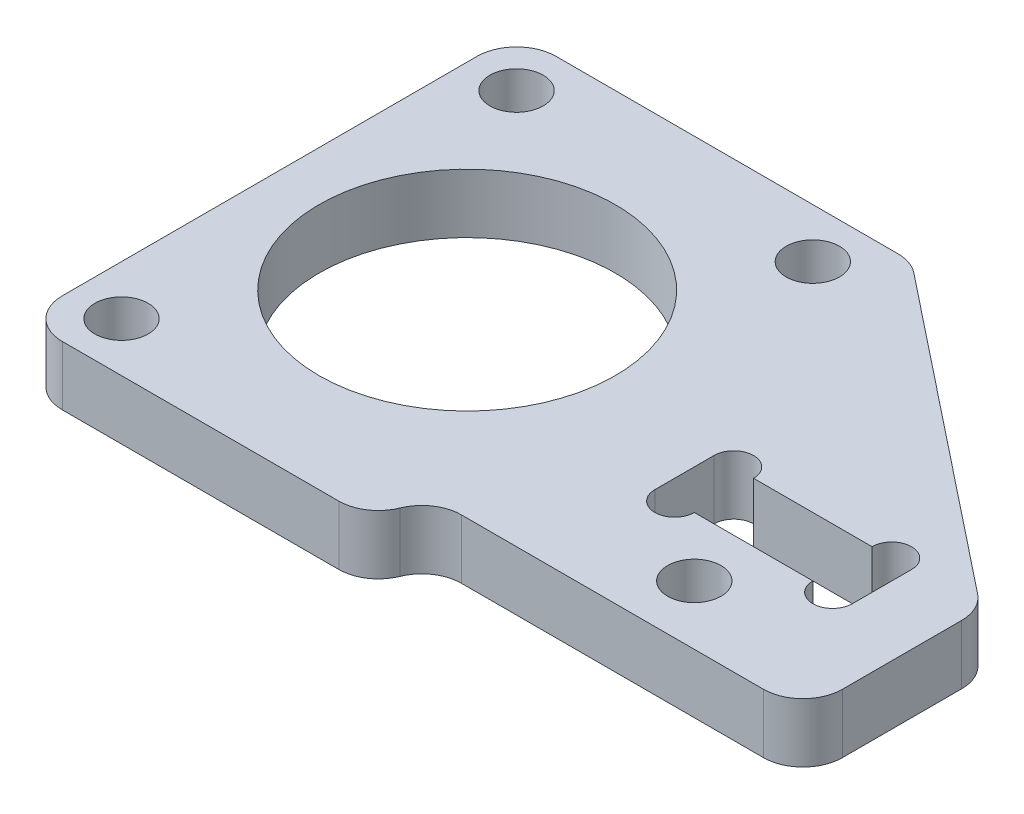
ISO-10303-21;
HEADER;
FILE_DESCRIPTION(('STEP AP214'),'2;1');
FILE_NAME('part.step','',(''),(''),'','','');
FILE_SCHEMA(('AUTOMOTIVE_DESIGN { 1 0 10303 214 1 1 1 1 }'));
ENDSEC;
DATA;
#1=APPLICATION_CONTEXT('core data for automotive mechanical design processes');
#2=APPLICATION_PROTOCOL_DEFINITION('international standard','automotive_design',2000,#1);
#3=PRODUCT_CONTEXT('',#1,'mechanical');
#4=PRODUCT('Part','Part','',(#3));
#5=PRODUCT_RELATED_PRODUCT_CATEGORY('part','',(#4));
#6=PRODUCT_DEFINITION_FORMATION('','',#4);
#7=PRODUCT_DEFINITION_CONTEXT('part definition',#1,'design');
#8=PRODUCT_DEFINITION('design','',#6,#7);
#9=PRODUCT_DEFINITION_SHAPE('','',#8);
#10=(LENGTH_UNIT() NAMED_UNIT(*) SI_UNIT(.MILLI.,.METRE.));
#11=(NAMED_UNIT(*) PLANE_ANGLE_UNIT() SI_UNIT($,.RADIAN.));
#12=(NAMED_UNIT(*) SI_UNIT($,.STERADIAN.) SOLID_ANGLE_UNIT());
#13=UNCERTAINTY_MEASURE_WITH_UNIT(LENGTH_MEASURE(1.E-05),#10,'distance_accuracy_value','');
#14=(GEOMETRIC_REPRESENTATION_CONTEXT(3) GLOBAL_UNCERTAINTY_ASSIGNED_CONTEXT((#13)) GLOBAL_UNIT_ASSIGNED_CONTEXT((#10,
#11,#12)) REPRESENTATION_CONTEXT('',''));
#15=CARTESIAN_POINT('',(0.,0.,0.));
#16=DIRECTION('',(0.,0.,1.));
#17=DIRECTION('',(1.,0.,0.));
#18=AXIS2_PLACEMENT_3D('',#15,#16,#17);
#19=CARTESIAN_POINT('',(10.,3.,4.));
#20=DIRECTION('',(0.,0.,1.));
#21=DIRECTION('',(1.,0.,0.));
#22=AXIS2_PLACEMENT_3D('',#19,#20,#21);
#23=PLANE('',#22);
#24=DIRECTION('',(-1.,0.,0.));
#25=VECTOR('',#24,1.);
#26=CARTESIAN_POINT('',(10.,3.,4.));
#27=LINE('',#26,#25);
#28=CARTESIAN_POINT('',(21.5,3.,4.));
#29=VERTEX_POINT('',#28);
#30=CARTESIAN_POINT('',(15.5,3.,4.));
#31=VERTEX_POINT('',#30);
#32=EDGE_CURVE('E276',#29,#31,#27,.T.);
#33=ORIENTED_EDGE('',*,*,#32,.F.);
#34=DIRECTION('',(0.,1.,0.));
#35=VECTOR('',#34,1.);
#36=CARTESIAN_POINT('',(21.5,0.,4.));
#37=LINE('',#36,#35);
#38=CARTESIAN_POINT('',(21.5,0.,4.));
#39=VERTEX_POINT('',#38);
#40=EDGE_CURVE('E668',#39,#29,#37,.T.);
#41=ORIENTED_EDGE('',*,*,#40,.F.);
#42=DIRECTION('',(-1.,0.,0.));
#43=VECTOR('',#42,1.);
#44=CARTESIAN_POINT('',(10.,0.,4.));
#45=LINE('',#44,#43);
#46=CARTESIAN_POINT('',(15.5,0.,4.));
#47=VERTEX_POINT('',#46);
#48=EDGE_CURVE('E265',#39,#47,#45,.T.);
#49=ORIENTED_EDGE('',*,*,#48,.T.);
#50=DIRECTION('',(0.,1.,0.));
#51=VECTOR('',#50,1.);
#52=CARTESIAN_POINT('',(15.5,0.,4.));
#53=LINE('',#52,#51);
#54=EDGE_CURVE('E666',#47,#31,#53,.T.);
#55=ORIENTED_EDGE('',*,*,#54,.T.);
#56=EDGE_LOOP('',(#33,#41,#49,#55));
#57=FACE_BOUND('',#56,.T.);
#58=ADVANCED_FACE('F36',(#57),#23,.F.);
#59=CARTESIAN_POINT('',(0.,3.,0.));
#60=DIRECTION('',(0.,-1.,0.));
#61=DIRECTION('',(0.,0.,-1.));
#62=AXIS2_PLACEMENT_3D('',#59,#60,#61);
#63=PLANE('',#62);
#64=DIRECTION('',(-0.783110847498294,0.,-0.621882143601586));
#65=VECTOR('',#64,1.);
#66=CARTESIAN_POINT('',(9.95490716180371,3.,-12.5358090185676));
#67=LINE('',#66,#65);
#68=CARTESIAN_POINT('',(26.2437642872032,3.,0.399459875131932));
#69=VERTEX_POINT('',#68);
#70=CARTESIAN_POINT('',(10.5462393470413,3.,-12.0662216949966));
#71=VERTEX_POINT('',#70);
#72=EDGE_CURVE('E386',#69,#71,#67,.T.);
#73=ORIENTED_EDGE('',*,*,#72,.T.);
#74=CARTESIAN_POINT('',(9.30247505983817,3.,-10.5));
#75=DIRECTION('',(0.,-1.,0.));
#76=DIRECTION('',(0.,0.,-1.));
#77=AXIS2_PLACEMENT_3D('',#74,#75,#76);
#78=CIRCLE('',#77,2.);
#79=CARTESIAN_POINT('',(9.30247505983817,3.,-12.5));
#80=VERTEX_POINT('',#79);
#81=EDGE_CURVE('E342',#71,#80,#78,.F.);
#82=ORIENTED_EDGE('',*,*,#81,.T.);
#83=DIRECTION('',(-1.,0.,0.));
#84=VECTOR('',#83,1.);
#85=CARTESIAN_POINT('',(-10.,3.,-12.5));
#86=LINE('',#85,#84);
#87=CARTESIAN_POINT('',(-8.,3.,-12.5));
#88=VERTEX_POINT('',#87);
#89=EDGE_CURVE('E262',#80,#88,#86,.T.);
#90=ORIENTED_EDGE('',*,*,#89,.T.);
#91=CARTESIAN_POINT('',(-8.,3.,-10.5));
#92=DIRECTION('',(0.,-1.,0.));
#93=DIRECTION('',(0.,0.,-1.));
#94=AXIS2_PLACEMENT_3D('',#91,#92,#93);
#95=CIRCLE('',#94,2.);
#96=CARTESIAN_POINT('',(-10.,3.,-10.5));
#97=VERTEX_POINT('',#96);
#98=EDGE_CURVE('E309',#88,#97,#95,.F.);
#99=ORIENTED_EDGE('',*,*,#98,.T.);
#100=DIRECTION('',(0.,0.,1.));
#101=VECTOR('',#100,1.);
#102=CARTESIAN_POINT('',(-10.,3.,12.5));
#103=LINE('',#102,#101);
#104=CARTESIAN_POINT('',(-10.,3.,10.5));
#105=VERTEX_POINT('',#104);
#106=EDGE_CURVE('E264',#97,#105,#103,.T.);
#107=ORIENTED_EDGE('',*,*,#106,.T.);
#108=CARTESIAN_POINT('',(-8.,3.,10.5));
#109=DIRECTION('',(0.,-1.,0.));
#110=DIRECTION('',(0.,0.,-1.));
#111=AXIS2_PLACEMENT_3D('',#108,#109,#110);
#112=CIRCLE('',#111,2.);
#113=CARTESIAN_POINT('',(-8.,3.,12.5));
#114=VERTEX_POINT('',#113);
#115=EDGE_CURVE('E311',#105,#114,#112,.F.);
#116=ORIENTED_EDGE('',*,*,#115,.T.);
#117=DIRECTION('',(1.,0.,0.));
#118=VECTOR('',#117,1.);
#119=CARTESIAN_POINT('',(-10.,3.,12.5));
#120=LINE('',#119,#118);
#121=CARTESIAN_POINT('',(6.00000000000001,3.,12.5));
#122=VERTEX_POINT('',#121);
#123=EDGE_CURVE('E268',#114,#122,#120,.T.);
#124=ORIENTED_EDGE('',*,*,#123,.T.);
#125=CARTESIAN_POINT('',(6.00000000000001,3.,10.5));
#126=DIRECTION('',(0.,-1.,0.));
#127=DIRECTION('',(0.,0.,-1.));
#128=AXIS2_PLACEMENT_3D('',#125,#126,#127);
#129=CIRCLE('',#128,2.);
#130=CARTESIAN_POINT('',(7.85404962177392,3.,11.25));
#131=VERTEX_POINT('',#130);
#132=EDGE_CURVE('E313',#122,#131,#129,.F.);
#133=ORIENTED_EDGE('',*,*,#132,.T.);
#134=CARTESIAN_POINT('',(9.70809924354784,3.,12.));
#135=DIRECTION('',(0.,-1.,0.));
#136=DIRECTION('',(0.,0.,-1.));
#137=AXIS2_PLACEMENT_3D('',#134,#135,#136);
#138=CIRCLE('',#137,2.);
#139=CARTESIAN_POINT('',(9.70809924354784,3.,10.));
#140=VERTEX_POINT('',#139);
#141=EDGE_CURVE('E11',#131,#140,#138,.T.);
#142=ORIENTED_EDGE('',*,*,#141,.T.);
#143=DIRECTION('',(1.,0.,0.));
#144=VECTOR('',#143,1.);
#145=CARTESIAN_POINT('',(8.00000000000001,3.,10.));
#146=LINE('',#145,#144);
#147=CARTESIAN_POINT('',(25.,3.,10.));
#148=VERTEX_POINT('',#147);
#149=EDGE_CURVE('E271',#140,#148,#146,.T.);
#150=ORIENTED_EDGE('',*,*,#149,.T.);
#151=CARTESIAN_POINT('',(25.,3.,8.));
#152=DIRECTION('',(0.,-1.,0.));
#153=DIRECTION('',(0.,0.,-1.));
#154=AXIS2_PLACEMENT_3D('',#151,#152,#153);
#155=CIRCLE('',#154,2.);
#156=CARTESIAN_POINT('',(27.,3.,8.));
#157=VERTEX_POINT('',#156);
#158=EDGE_CURVE('E315',#148,#157,#155,.F.);
#159=ORIENTED_EDGE('',*,*,#158,.T.);
#160=DIRECTION('',(0.,0.,-1.));
#161=VECTOR('',#160,1.);
#162=CARTESIAN_POINT('',(27.,3.,4.));
#163=LINE('',#162,#161);
#164=CARTESIAN_POINT('',(27.,3.,1.96568157012852));
#165=VERTEX_POINT('',#164);
#166=EDGE_CURVE('E273',#157,#165,#163,.T.);
#167=ORIENTED_EDGE('',*,*,#166,.T.);
#168=CARTESIAN_POINT('',(25.,3.,1.96568157012852));
#169=DIRECTION('',(0.,-1.,0.));
#170=DIRECTION('',(0.,0.,-1.));
#171=AXIS2_PLACEMENT_3D('',#168,#169,#170);
#172=CIRCLE('',#171,2.);
#173=EDGE_CURVE('E59',#165,#69,#172,.F.);
#174=ORIENTED_EDGE('',*,*,#173,.T.);
#175=EDGE_LOOP('',(#73,#82,#90,#99,#107,#116,#124,#133,#142,#150,#159,#167,#174));
#176=FACE_BOUND('',#175,.T.);
#177=DIRECTION('',(0.,0.,1.));
#178=VECTOR('',#177,1.);
#179=CARTESIAN_POINT('',(23.5,3.,0.));
#180=LINE('',#179,#178);
#181=CARTESIAN_POINT('',(23.5,3.,1.));
#182=VERTEX_POINT('',#181);
#183=CARTESIAN_POINT('',(23.5,3.,4.));
#184=VERTEX_POINT('',#183);
#185=EDGE_CURVE('E213',#182,#184,#180,.T.);
#186=ORIENTED_EDGE('',*,*,#185,.T.);
#187=CARTESIAN_POINT('',(22.5,3.,4.));
#188=DIRECTION('',(0.,1.,0.));
#189=DIRECTION('',(0.,0.,-1.));
#190=AXIS2_PLACEMENT_3D('',#187,#188,#189);
#191=CIRCLE('',#190,1.);
#192=EDGE_CURVE('E676',#29,#184,#191,.T.);
#193=ORIENTED_EDGE('',*,*,#192,.F.);
#194=ORIENTED_EDGE('',*,*,#32,.T.);
#195=CARTESIAN_POINT('',(14.5,3.,4.));
#196=DIRECTION('',(0.,1.,0.));
#197=DIRECTION('',(0.,0.,1.));
#198=AXIS2_PLACEMENT_3D('',#195,#196,#197);
#199=CIRCLE('',#198,1.);
#200=CARTESIAN_POINT('',(13.5,3.,4.));
#201=VERTEX_POINT('',#200);
#202=EDGE_CURVE('E664',#201,#31,#199,.T.);
#203=ORIENTED_EDGE('',*,*,#202,.F.);
#204=DIRECTION('',(0.,0.,1.));
#205=VECTOR('',#204,1.);
#206=CARTESIAN_POINT('',(13.5,3.,0.));
#207=LINE('',#206,#205);
#208=CARTESIAN_POINT('',(13.5,3.,1.));
#209=VERTEX_POINT('',#208);
#210=EDGE_CURVE('E191',#209,#201,#207,.T.);
#211=ORIENTED_EDGE('',*,*,#210,.F.);
#212=CARTESIAN_POINT('',(14.5,3.,1.));
#213=DIRECTION('',(0.,1.,0.));
#214=DIRECTION('',(0.,0.,-1.));
#215=AXIS2_PLACEMENT_3D('',#212,#213,#214);
#216=CIRCLE('',#215,1.);
#217=CARTESIAN_POINT('',(15.5,3.,1.));
#218=VERTEX_POINT('',#217);
#219=EDGE_CURVE('E186',#218,#209,#216,.T.);
#220=ORIENTED_EDGE('',*,*,#219,.F.);
#221=DIRECTION('',(1.,0.,0.));
#222=VECTOR('',#221,1.);
#223=CARTESIAN_POINT('',(0.,3.,1.));
#224=LINE('',#223,#222);
#225=CARTESIAN_POINT('',(21.5,3.,1.));
#226=VERTEX_POINT('',#225);
#227=EDGE_CURVE('E209',#218,#226,#224,.T.);
#228=ORIENTED_EDGE('',*,*,#227,.T.);
#229=CARTESIAN_POINT('',(22.5,3.,1.));
#230=DIRECTION('',(0.,1.,0.));
#231=DIRECTION('',(0.,0.,1.));
#232=AXIS2_PLACEMENT_3D('',#229,#230,#231);
#233=CIRCLE('',#232,1.);
#234=EDGE_CURVE('E685',#182,#226,#233,.T.);
#235=ORIENTED_EDGE('',*,*,#234,.F.);
#236=EDGE_LOOP('',(#186,#193,#194,#203,#211,#220,#228,#235));
#237=FACE_BOUND('',#236,.T.);
#238=CARTESIAN_POINT('',(18.5,3.,7.));
#239=DIRECTION('',(0.,1.,0.));
#240=DIRECTION('',(0.,0.,1.));
#241=AXIS2_PLACEMENT_3D('',#238,#239,#240);
#242=CIRCLE('',#241,1.35000000000001);
#243=CARTESIAN_POINT('',(18.5,3.,8.35000000000001));
#244=VERTEX_POINT('',#243);
#245=EDGE_CURVE('E236',#244,#244,#242,.T.);
#246=ORIENTED_EDGE('',*,*,#245,.F.);
#247=EDGE_LOOP('',(#246));
#248=FACE_BOUND('',#247,.T.);
#249=CARTESIAN_POINT('',(-7.5,3.,10.));
#250=DIRECTION('',(0.,1.,0.));
#251=DIRECTION('',(0.,0.,-1.));
#252=AXIS2_PLACEMENT_3D('',#249,#250,#251);
#253=CIRCLE('',#252,1.35);
#254=CARTESIAN_POINT('',(-7.5,3.,8.65));
#255=VERTEX_POINT('',#254);
#256=EDGE_CURVE('E242',#255,#255,#253,.T.);
#257=ORIENTED_EDGE('',*,*,#256,.F.);
#258=EDGE_LOOP('',(#257));
#259=FACE_BOUND('',#258,.T.);
#260=CARTESIAN_POINT('',(-7.5,3.,-10.));
#261=DIRECTION('',(0.,1.,0.));
#262=DIRECTION('',(0.,0.,1.));
#263=AXIS2_PLACEMENT_3D('',#260,#261,#262);
#264=CIRCLE('',#263,1.35);
#265=CARTESIAN_POINT('',(-7.5,3.,-8.65));
#266=VERTEX_POINT('',#265);
#267=EDGE_CURVE('E248',#266,#266,#264,.T.);
#268=ORIENTED_EDGE('',*,*,#267,.F.);
#269=EDGE_LOOP('',(#268));
#270=FACE_BOUND('',#269,.T.);
#271=CARTESIAN_POINT('',(7.5,3.,-10.));
#272=DIRECTION('',(0.,1.,0.));
#273=DIRECTION('',(0.,0.,-1.));
#274=AXIS2_PLACEMENT_3D('',#271,#272,#273);
#275=CIRCLE('',#274,1.35);
#276=CARTESIAN_POINT('',(7.5,3.,-11.35));
#277=VERTEX_POINT('',#276);
#278=EDGE_CURVE('E231',#277,#277,#275,.T.);
#279=ORIENTED_EDGE('',*,*,#278,.F.);
#280=EDGE_LOOP('',(#279));
#281=FACE_BOUND('',#280,.T.);
#282=CARTESIAN_POINT('',(0.,3.,0.));
#283=DIRECTION('',(0.,1.,0.));
#284=DIRECTION('',(0.,0.,1.));
#285=AXIS2_PLACEMENT_3D('',#282,#283,#284);
#286=CIRCLE('',#285,7.5);
#287=CARTESIAN_POINT('',(0.,3.,7.5));
#288=VERTEX_POINT('',#287);
#289=EDGE_CURVE('E256',#288,#288,#286,.T.);
#290=ORIENTED_EDGE('',*,*,#289,.F.);
#291=EDGE_LOOP('',(#290));
#292=FACE_BOUND('',#291,.T.);
#293=ADVANCED_FACE('F361',(#176,#237,#248,#259,#270,#281,#292),#63,.F.);
#294=CARTESIAN_POINT('',(0.,0.,0.));
#295=DIRECTION('',(0.,-1.,0.));
#296=DIRECTION('',(0.,0.,-1.));
#297=AXIS2_PLACEMENT_3D('',#294,#295,#296);
#298=PLANE('',#297);
#299=CARTESIAN_POINT('',(22.5,0.,4.));
#300=DIRECTION('',(0.,1.,0.));
#301=DIRECTION('',(0.,0.,-1.));
#302=AXIS2_PLACEMENT_3D('',#299,#300,#301);
#303=CIRCLE('',#302,1.);
#304=CARTESIAN_POINT('',(23.5,0.,4.));
#305=VERTEX_POINT('',#304);
#306=EDGE_CURVE('E679',#39,#305,#303,.T.);
#307=ORIENTED_EDGE('',*,*,#306,.T.);
#308=DIRECTION('',(0.,0.,1.));
#309=VECTOR('',#308,1.);
#310=CARTESIAN_POINT('',(23.5,0.,0.));
#311=LINE('',#310,#309);
#312=CARTESIAN_POINT('',(23.5,0.,1.));
#313=VERTEX_POINT('',#312);
#314=EDGE_CURVE('E228',#313,#305,#311,.T.);
#315=ORIENTED_EDGE('',*,*,#314,.F.);
#316=CARTESIAN_POINT('',(22.5,0.,1.));
#317=DIRECTION('',(0.,1.,0.));
#318=DIRECTION('',(0.,0.,1.));
#319=AXIS2_PLACEMENT_3D('',#316,#317,#318);
#320=CIRCLE('',#319,1.);
#321=CARTESIAN_POINT('',(21.5,0.,1.));
#322=VERTEX_POINT('',#321);
#323=EDGE_CURVE('E216',#313,#322,#320,.T.);
#324=ORIENTED_EDGE('',*,*,#323,.T.);
#325=DIRECTION('',(1.,0.,0.));
#326=VECTOR('',#325,1.);
#327=CARTESIAN_POINT('',(0.,0.,1.));
#328=LINE('',#327,#326);
#329=CARTESIAN_POINT('',(15.5,0.,1.));
#330=VERTEX_POINT('',#329);
#331=EDGE_CURVE('E205',#330,#322,#328,.T.);
#332=ORIENTED_EDGE('',*,*,#331,.F.);
#333=CARTESIAN_POINT('',(14.5,0.,1.));
#334=DIRECTION('',(0.,1.,0.));
#335=DIRECTION('',(0.,0.,-1.));
#336=AXIS2_PLACEMENT_3D('',#333,#334,#335);
#337=CIRCLE('',#336,1.);
#338=CARTESIAN_POINT('',(13.5,0.,1.));
#339=VERTEX_POINT('',#338);
#340=EDGE_CURVE('E183',#330,#339,#337,.T.);
#341=ORIENTED_EDGE('',*,*,#340,.T.);
#342=DIRECTION('',(0.,0.,1.));
#343=VECTOR('',#342,1.);
#344=CARTESIAN_POINT('',(13.5,0.,0.));
#345=LINE('',#344,#343);
#346=CARTESIAN_POINT('',(13.5,0.,4.));
#347=VERTEX_POINT('',#346);
#348=EDGE_CURVE('E201',#339,#347,#345,.T.);
#349=ORIENTED_EDGE('',*,*,#348,.T.);
#350=CARTESIAN_POINT('',(14.5,0.,4.));
#351=DIRECTION('',(0.,1.,0.));
#352=DIRECTION('',(0.,0.,1.));
#353=AXIS2_PLACEMENT_3D('',#350,#351,#352);
#354=CIRCLE('',#353,1.);
#355=EDGE_CURVE('E667',#347,#47,#354,.T.);
#356=ORIENTED_EDGE('',*,*,#355,.T.);
#357=ORIENTED_EDGE('',*,*,#48,.F.);
#358=EDGE_LOOP('',(#307,#315,#324,#332,#341,#349,#356,#357));
#359=FACE_BOUND('',#358,.T.);
#360=DIRECTION('',(-1.,0.,0.));
#361=VECTOR('',#360,1.);
#362=CARTESIAN_POINT('',(-10.,0.,-12.5));
#363=LINE('',#362,#361);
#364=CARTESIAN_POINT('',(9.30247505983817,0.,-12.5));
#365=VERTEX_POINT('',#364);
#366=CARTESIAN_POINT('',(-8.,0.,-12.5));
#367=VERTEX_POINT('',#366);
#368=EDGE_CURVE('E259',#365,#367,#363,.T.);
#369=ORIENTED_EDGE('',*,*,#368,.F.);
#370=CARTESIAN_POINT('',(9.30247505983817,0.,-10.5));
#371=DIRECTION('',(0.,-1.,0.));
#372=DIRECTION('',(0.,0.,-1.));
#373=AXIS2_PLACEMENT_3D('',#370,#371,#372);
#374=CIRCLE('',#373,2.);
#375=CARTESIAN_POINT('',(10.5462393470413,0.,-12.0662216949966));
#376=VERTEX_POINT('',#375);
#377=EDGE_CURVE('E335',#365,#376,#374,.T.);
#378=ORIENTED_EDGE('',*,*,#377,.T.);
#379=DIRECTION('',(-0.783110847498294,0.,-0.621882143601586));
#380=VECTOR('',#379,1.);
#381=CARTESIAN_POINT('',(9.95490716180371,0.,-12.5358090185676));
#382=LINE('',#381,#380);
#383=CARTESIAN_POINT('',(26.2437642872032,0.,0.399459875131932));
#384=VERTEX_POINT('',#383);
#385=EDGE_CURVE('E221',#384,#376,#382,.T.);
#386=ORIENTED_EDGE('',*,*,#385,.F.);
#387=CARTESIAN_POINT('',(25.,0.,1.96568157012852));
#388=DIRECTION('',(0.,-1.,0.));
#389=DIRECTION('',(0.,0.,-1.));
#390=AXIS2_PLACEMENT_3D('',#387,#388,#389);
#391=CIRCLE('',#390,2.);
#392=CARTESIAN_POINT('',(27.,0.,1.96568157012852));
#393=VERTEX_POINT('',#392);
#394=EDGE_CURVE('E333',#384,#393,#391,.T.);
#395=ORIENTED_EDGE('',*,*,#394,.T.);
#396=DIRECTION('',(0.,0.,-1.));
#397=VECTOR('',#396,1.);
#398=CARTESIAN_POINT('',(27.,0.,4.));
#399=LINE('',#398,#397);
#400=CARTESIAN_POINT('',(27.,0.,8.));
#401=VERTEX_POINT('',#400);
#402=EDGE_CURVE('E289',#401,#393,#399,.T.);
#403=ORIENTED_EDGE('',*,*,#402,.F.);
#404=CARTESIAN_POINT('',(25.,0.,8.));
#405=DIRECTION('',(0.,-1.,0.));
#406=DIRECTION('',(0.,0.,-1.));
#407=AXIS2_PLACEMENT_3D('',#404,#405,#406);
#408=CIRCLE('',#407,2.);
#409=CARTESIAN_POINT('',(25.,0.,10.));
#410=VERTEX_POINT('',#409);
#411=EDGE_CURVE('E303',#401,#410,#408,.T.);
#412=ORIENTED_EDGE('',*,*,#411,.T.);
#413=DIRECTION('',(1.,0.,0.));
#414=VECTOR('',#413,1.);
#415=CARTESIAN_POINT('',(8.00000000000001,0.,10.));
#416=LINE('',#415,#414);
#417=CARTESIAN_POINT('',(9.70809924354784,0.,10.));
#418=VERTEX_POINT('',#417);
#419=EDGE_CURVE('E287',#418,#410,#416,.T.);
#420=ORIENTED_EDGE('',*,*,#419,.F.);
#421=CARTESIAN_POINT('',(9.70809924354784,0.,12.));
#422=DIRECTION('',(0.,-1.,0.));
#423=DIRECTION('',(0.,0.,-1.));
#424=AXIS2_PLACEMENT_3D('',#421,#422,#423);
#425=CIRCLE('',#424,2.);
#426=CARTESIAN_POINT('',(7.85404962177392,0.,11.25));
#427=VERTEX_POINT('',#426);
#428=EDGE_CURVE('E44',#418,#427,#425,.F.);
#429=ORIENTED_EDGE('',*,*,#428,.T.);
#430=CARTESIAN_POINT('',(6.00000000000001,0.,10.5));
#431=DIRECTION('',(0.,-1.,0.));
#432=DIRECTION('',(0.,0.,-1.));
#433=AXIS2_PLACEMENT_3D('',#430,#431,#432);
#434=CIRCLE('',#433,2.);
#435=CARTESIAN_POINT('',(6.00000000000001,0.,12.5));
#436=VERTEX_POINT('',#435);
#437=EDGE_CURVE('E301',#427,#436,#434,.T.);
#438=ORIENTED_EDGE('',*,*,#437,.T.);
#439=DIRECTION('',(1.,0.,0.));
#440=VECTOR('',#439,1.);
#441=CARTESIAN_POINT('',(8.00000000000001,0.,12.5));
#442=LINE('',#441,#440);
#443=CARTESIAN_POINT('',(-8.,0.,12.5));
#444=VERTEX_POINT('',#443);
#445=EDGE_CURVE('E284',#444,#436,#442,.T.);
#446=ORIENTED_EDGE('',*,*,#445,.F.);
#447=CARTESIAN_POINT('',(-8.,0.,10.5));
#448=DIRECTION('',(0.,-1.,0.));
#449=DIRECTION('',(0.,0.,-1.));
#450=AXIS2_PLACEMENT_3D('',#447,#448,#449);
#451=CIRCLE('',#450,2.);
#452=CARTESIAN_POINT('',(-10.,0.,10.5));
#453=VERTEX_POINT('',#452);
#454=EDGE_CURVE('E299',#444,#453,#451,.T.);
#455=ORIENTED_EDGE('',*,*,#454,.T.);
#456=DIRECTION('',(0.,0.,1.));
#457=VECTOR('',#456,1.);
#458=CARTESIAN_POINT('',(-10.,0.,12.5));
#459=LINE('',#458,#457);
#460=CARTESIAN_POINT('',(-10.,0.,-10.5));
#461=VERTEX_POINT('',#460);
#462=EDGE_CURVE('E281',#461,#453,#459,.T.);
#463=ORIENTED_EDGE('',*,*,#462,.F.);
#464=CARTESIAN_POINT('',(-8.,0.,-10.5));
#465=DIRECTION('',(0.,-1.,0.));
#466=DIRECTION('',(0.,0.,-1.));
#467=AXIS2_PLACEMENT_3D('',#464,#465,#466);
#468=CIRCLE('',#467,2.);
#469=EDGE_CURVE('E296',#461,#367,#468,.T.);
#470=ORIENTED_EDGE('',*,*,#469,.T.);
#471=EDGE_LOOP('',(#369,#378,#386,#395,#403,#412,#420,#429,#438,#446,#455,#463,#470));
#472=FACE_BOUND('',#471,.T.);
#473=CARTESIAN_POINT('',(18.5,0.,7.));
#474=DIRECTION('',(0.,1.,0.));
#475=DIRECTION('',(0.,0.,1.));
#476=AXIS2_PLACEMENT_3D('',#473,#474,#475);
#477=CIRCLE('',#476,1.35000000000001);
#478=CARTESIAN_POINT('',(18.5,0.,8.35000000000001));
#479=VERTEX_POINT('',#478);
#480=EDGE_CURVE('E232',#479,#479,#477,.T.);
#481=ORIENTED_EDGE('',*,*,#480,.T.);
#482=EDGE_LOOP('',(#481));
#483=FACE_BOUND('',#482,.T.);
#484=CARTESIAN_POINT('',(-7.5,0.,10.));
#485=DIRECTION('',(0.,1.,0.));
#486=DIRECTION('',(0.,0.,-1.));
#487=AXIS2_PLACEMENT_3D('',#484,#485,#486);
#488=CIRCLE('',#487,1.35);
#489=CARTESIAN_POINT('',(-7.5,0.,8.65));
#490=VERTEX_POINT('',#489);
#491=EDGE_CURVE('E239',#490,#490,#488,.T.);
#492=ORIENTED_EDGE('',*,*,#491,.T.);
#493=EDGE_LOOP('',(#492));
#494=FACE_BOUND('',#493,.T.);
#495=CARTESIAN_POINT('',(-7.5,0.,-10.));
#496=DIRECTION('',(0.,1.,0.));
#497=DIRECTION('',(0.,0.,1.));
#498=AXIS2_PLACEMENT_3D('',#495,#496,#497);
#499=CIRCLE('',#498,1.35);
#500=CARTESIAN_POINT('',(-7.5,0.,-8.65));
#501=VERTEX_POINT('',#500);
#502=EDGE_CURVE('E245',#501,#501,#499,.T.);
#503=ORIENTED_EDGE('',*,*,#502,.T.);
#504=EDGE_LOOP('',(#503));
#505=FACE_BOUND('',#504,.T.);
#506=CARTESIAN_POINT('',(7.5,0.,-10.));
#507=DIRECTION('',(0.,1.,0.));
#508=DIRECTION('',(0.,0.,-1.));
#509=AXIS2_PLACEMENT_3D('',#506,#507,#508);
#510=CIRCLE('',#509,1.35);
#511=CARTESIAN_POINT('',(7.5,0.,-11.35));
#512=VERTEX_POINT('',#511);
#513=EDGE_CURVE('E251',#512,#512,#510,.T.);
#514=ORIENTED_EDGE('',*,*,#513,.T.);
#515=EDGE_LOOP('',(#514));
#516=FACE_BOUND('',#515,.T.);
#517=CARTESIAN_POINT('',(0.,0.,0.));
#518=DIRECTION('',(0.,1.,0.));
#519=DIRECTION('',(0.,0.,1.));
#520=AXIS2_PLACEMENT_3D('',#517,#518,#519);
#521=CIRCLE('',#520,7.5);
#522=CARTESIAN_POINT('',(0.,0.,7.5));
#523=VERTEX_POINT('',#522);
#524=EDGE_CURVE('E235',#523,#523,#521,.T.);
#525=ORIENTED_EDGE('',*,*,#524,.T.);
#526=EDGE_LOOP('',(#525));
#527=FACE_BOUND('',#526,.T.);
#528=ADVANCED_FACE('F198',(#359,#472,#483,#494,#505,#516,#527),#298,.T.);
#529=CARTESIAN_POINT('',(-10.,3.,-12.5));
#530=DIRECTION('',(0.,0.,1.));
#531=DIRECTION('',(1.,0.,0.));
#532=AXIS2_PLACEMENT_3D('',#529,#530,#531);
#533=PLANE('',#532);
#534=ORIENTED_EDGE('',*,*,#89,.F.);
#535=DIRECTION('',(0.,-1.,0.));
#536=VECTOR('',#535,1.);
#537=CARTESIAN_POINT('',(9.30247505983817,0.,-12.5));
#538=LINE('',#537,#536);
#539=EDGE_CURVE('E330',#80,#365,#538,.T.);
#540=ORIENTED_EDGE('',*,*,#539,.T.);
#541=ORIENTED_EDGE('',*,*,#368,.T.);
#542=DIRECTION('',(0.,-1.,0.));
#543=VECTOR('',#542,1.);
#544=CARTESIAN_POINT('',(-8.,3.,-12.5));
#545=LINE('',#544,#543);
#546=EDGE_CURVE('E327',#367,#88,#545,.F.);
#547=ORIENTED_EDGE('',*,*,#546,.T.);
#548=EDGE_LOOP('',(#534,#540,#541,#547));
#549=FACE_BOUND('',#548,.T.);
#550=ADVANCED_FACE('F388',(#549),#533,.F.);
#551=CARTESIAN_POINT('',(-10.,3.,12.5));
#552=DIRECTION('',(1.,0.,0.));
#553=DIRECTION('',(0.,0.,-1.));
#554=AXIS2_PLACEMENT_3D('',#551,#552,#553);
#555=PLANE('',#554);
#556=ORIENTED_EDGE('',*,*,#462,.T.);
#557=DIRECTION('',(0.,-1.,0.));
#558=VECTOR('',#557,1.);
#559=CARTESIAN_POINT('',(-10.,3.,10.5));
#560=LINE('',#559,#558);
#561=EDGE_CURVE('E325',#453,#105,#560,.F.);
#562=ORIENTED_EDGE('',*,*,#561,.T.);
#563=ORIENTED_EDGE('',*,*,#106,.F.);
#564=DIRECTION('',(0.,-1.,0.));
#565=VECTOR('',#564,1.);
#566=CARTESIAN_POINT('',(-10.,3.,-10.5));
#567=LINE('',#566,#565);
#568=EDGE_CURVE('E322',#97,#461,#567,.T.);
#569=ORIENTED_EDGE('',*,*,#568,.T.);
#570=EDGE_LOOP('',(#556,#562,#563,#569));
#571=FACE_BOUND('',#570,.T.);
#572=ADVANCED_FACE('F397',(#571),#555,.F.);
#573=CARTESIAN_POINT('',(8.00000000000001,3.,12.5));
#574=DIRECTION('',(0.,0.,-1.));
#575=DIRECTION('',(-1.,0.,0.));
#576=AXIS2_PLACEMENT_3D('',#573,#574,#575);
#577=PLANE('',#576);
#578=ORIENTED_EDGE('',*,*,#445,.T.);
#579=DIRECTION('',(0.,-1.,0.));
#580=VECTOR('',#579,1.);
#581=CARTESIAN_POINT('',(6.00000000000001,3.,12.5));
#582=LINE('',#581,#580);
#583=EDGE_CURVE('E320',#436,#122,#582,.F.);
#584=ORIENTED_EDGE('',*,*,#583,.T.);
#585=ORIENTED_EDGE('',*,*,#123,.F.);
#586=DIRECTION('',(0.,-1.,0.));
#587=VECTOR('',#586,1.);
#588=CARTESIAN_POINT('',(-8.,3.,12.5));
#589=LINE('',#588,#587);
#590=EDGE_CURVE('E317',#114,#444,#589,.T.);
#591=ORIENTED_EDGE('',*,*,#590,.T.);
#592=EDGE_LOOP('',(#578,#584,#585,#591));
#593=FACE_BOUND('',#592,.T.);
#594=ADVANCED_FACE('F405',(#593),#577,.F.);
#595=CARTESIAN_POINT('',(8.00000000000001,3.,10.));
#596=DIRECTION('',(0.,0.,-1.));
#597=DIRECTION('',(-1.,0.,0.));
#598=AXIS2_PLACEMENT_3D('',#595,#596,#597);
#599=PLANE('',#598);
#600=ORIENTED_EDGE('',*,*,#149,.F.);
#601=DIRECTION('',(0.,-1.,0.));
#602=VECTOR('',#601,1.);
#603=CARTESIAN_POINT('',(9.70809924354784,3.,10.));
#604=LINE('',#603,#602);
#605=EDGE_CURVE('E346',#140,#418,#604,.T.);
#606=ORIENTED_EDGE('',*,*,#605,.T.);
#607=ORIENTED_EDGE('',*,*,#419,.T.);
#608=DIRECTION('',(0.,-1.,0.));
#609=VECTOR('',#608,1.);
#610=CARTESIAN_POINT('',(25.,3.,10.));
#611=LINE('',#610,#609);
#612=EDGE_CURVE('E306',#410,#148,#611,.F.);
#613=ORIENTED_EDGE('',*,*,#612,.T.);
#614=EDGE_LOOP('',(#600,#606,#607,#613));
#615=FACE_BOUND('',#614,.T.);
#616=ADVANCED_FACE('F364',(#615),#599,.F.);
#617=CARTESIAN_POINT('',(27.,3.,4.));
#618=DIRECTION('',(-1.,0.,0.));
#619=DIRECTION('',(0.,0.,1.));
#620=AXIS2_PLACEMENT_3D('',#617,#618,#619);
#621=PLANE('',#620);
#622=ORIENTED_EDGE('',*,*,#402,.T.);
#623=DIRECTION('',(0.,1.,0.));
#624=VECTOR('',#623,1.);
#625=CARTESIAN_POINT('',(27.,3.,1.96568157012852));
#626=LINE('',#625,#624);
#627=EDGE_CURVE('E344',#393,#165,#626,.T.);
#628=ORIENTED_EDGE('',*,*,#627,.T.);
#629=ORIENTED_EDGE('',*,*,#166,.F.);
#630=DIRECTION('',(0.,-1.,0.));
#631=VECTOR('',#630,1.);
#632=CARTESIAN_POINT('',(27.,3.,8.));
#633=LINE('',#632,#631);
#634=EDGE_CURVE('E279',#157,#401,#633,.T.);
#635=ORIENTED_EDGE('',*,*,#634,.T.);
#636=EDGE_LOOP('',(#622,#628,#629,#635));
#637=FACE_BOUND('',#636,.T.);
#638=ADVANCED_FACE('F372',(#637),#621,.F.);
#639=CARTESIAN_POINT('',(0.,3.,0.));
#640=DIRECTION('',(0.,-1.,0.));
#641=DIRECTION('',(0.,0.,-1.));
#642=AXIS2_PLACEMENT_3D('',#639,#640,#641);
#643=CYLINDRICAL_SURFACE('',#642,7.5);
#644=ORIENTED_EDGE('',*,*,#289,.T.);
#645=EDGE_LOOP('',(#644));
#646=FACE_BOUND('',#645,.T.);
#647=ORIENTED_EDGE('',*,*,#524,.F.);
#648=EDGE_LOOP('',(#647));
#649=FACE_BOUND('',#648,.T.);
#650=ADVANCED_FACE('F425',(#646,#649),#643,.F.);
#651=CARTESIAN_POINT('',(7.5,0.,-10.));
#652=DIRECTION('',(0.,1.,0.));
#653=DIRECTION('',(0.,0.,1.));
#654=AXIS2_PLACEMENT_3D('',#651,#652,#653);
#655=CYLINDRICAL_SURFACE('',#654,1.35);
#656=ORIENTED_EDGE('',*,*,#513,.F.);
#657=EDGE_LOOP('',(#656));
#658=FACE_BOUND('',#657,.T.);
#659=ORIENTED_EDGE('',*,*,#278,.T.);
#660=EDGE_LOOP('',(#659));
#661=FACE_BOUND('',#660,.T.);
#662=ADVANCED_FACE('F429',(#658,#661),#655,.F.);
#663=CARTESIAN_POINT('',(-7.5,0.,-10.));
#664=DIRECTION('',(0.,1.,0.));
#665=DIRECTION('',(0.,0.,1.));
#666=AXIS2_PLACEMENT_3D('',#663,#664,#665);
#667=CYLINDRICAL_SURFACE('',#666,1.35);
#668=ORIENTED_EDGE('',*,*,#502,.F.);
#669=EDGE_LOOP('',(#668));
#670=FACE_BOUND('',#669,.T.);
#671=ORIENTED_EDGE('',*,*,#267,.T.);
#672=EDGE_LOOP('',(#671));
#673=FACE_BOUND('',#672,.T.);
#674=ADVANCED_FACE('F435',(#670,#673),#667,.F.);
#675=CARTESIAN_POINT('',(-7.5,0.,10.));
#676=DIRECTION('',(0.,1.,0.));
#677=DIRECTION('',(0.,0.,1.));
#678=AXIS2_PLACEMENT_3D('',#675,#676,#677);
#679=CYLINDRICAL_SURFACE('',#678,1.35);
#680=ORIENTED_EDGE('',*,*,#491,.F.);
#681=EDGE_LOOP('',(#680));
#682=FACE_BOUND('',#681,.T.);
#683=ORIENTED_EDGE('',*,*,#256,.T.);
#684=EDGE_LOOP('',(#683));
#685=FACE_BOUND('',#684,.T.);
#686=ADVANCED_FACE('F442',(#682,#685),#679,.F.);
#687=CARTESIAN_POINT('',(18.5,0.,7.));
#688=DIRECTION('',(0.,1.,0.));
#689=DIRECTION('',(0.,0.,1.));
#690=AXIS2_PLACEMENT_3D('',#687,#688,#689);
#691=CYLINDRICAL_SURFACE('',#690,1.35000000000001);
#692=ORIENTED_EDGE('',*,*,#480,.F.);
#693=EDGE_LOOP('',(#692));
#694=FACE_BOUND('',#693,.T.);
#695=ORIENTED_EDGE('',*,*,#245,.T.);
#696=EDGE_LOOP('',(#695));
#697=FACE_BOUND('',#696,.T.);
#698=ADVANCED_FACE('F446',(#694,#697),#691,.F.);
#699=CARTESIAN_POINT('',(23.5,-23.6907154809643,0.));
#700=DIRECTION('',(-1.,0.,0.));
#701=DIRECTION('',(0.,0.,1.));
#702=AXIS2_PLACEMENT_3D('',#699,#700,#701);
#703=PLANE('',#702);
#704=DIRECTION('',(0.,1.,0.));
#705=VECTOR('',#704,1.);
#706=CARTESIAN_POINT('',(23.5,-23.6907154809643,1.));
#707=LINE('',#706,#705);
#708=EDGE_CURVE('E229',#313,#182,#707,.T.);
#709=ORIENTED_EDGE('',*,*,#708,.F.);
#710=ORIENTED_EDGE('',*,*,#314,.T.);
#711=DIRECTION('',(0.,1.,0.));
#712=VECTOR('',#711,1.);
#713=CARTESIAN_POINT('',(23.5,-23.6907154809643,4.));
#714=LINE('',#713,#712);
#715=EDGE_CURVE('E223',#305,#184,#714,.T.);
#716=ORIENTED_EDGE('',*,*,#715,.T.);
#717=ORIENTED_EDGE('',*,*,#185,.F.);
#718=EDGE_LOOP('',(#709,#710,#716,#717));
#719=FACE_BOUND('',#718,.T.);
#720=ADVANCED_FACE('F450',(#719),#703,.T.);
#721=CARTESIAN_POINT('',(9.95490716180371,-23.6907154809643,-12.5358090185676));
#722=DIRECTION('',(0.621882143601586,0.,-0.783110847498294));
#723=DIRECTION('',(-0.783110847498294,0.,-0.621882143601586));
#724=AXIS2_PLACEMENT_3D('',#721,#722,#723);
#725=PLANE('',#724);
#726=ORIENTED_EDGE('',*,*,#385,.T.);
#727=DIRECTION('',(0.,-1.,0.));
#728=VECTOR('',#727,1.);
#729=CARTESIAN_POINT('',(10.5462393470413,3.,-12.0662216949966));
#730=LINE('',#729,#728);
#731=EDGE_CURVE('E339',#376,#71,#730,.F.);
#732=ORIENTED_EDGE('',*,*,#731,.T.);
#733=ORIENTED_EDGE('',*,*,#72,.F.);
#734=DIRECTION('',(0.,1.,0.));
#735=VECTOR('',#734,1.);
#736=CARTESIAN_POINT('',(26.2437642872032,0.,0.399459875131931));
#737=LINE('',#736,#735);
#738=EDGE_CURVE('E337',#69,#384,#737,.F.);
#739=ORIENTED_EDGE('',*,*,#738,.T.);
#740=EDGE_LOOP('',(#726,#732,#733,#739));
#741=FACE_BOUND('',#740,.T.);
#742=ADVANCED_FACE('F379',(#741),#725,.T.);
#743=CARTESIAN_POINT('',(13.5,-23.6907154809643,0.));
#744=DIRECTION('',(-1.,0.,0.));
#745=DIRECTION('',(0.,0.,1.));
#746=AXIS2_PLACEMENT_3D('',#743,#744,#745);
#747=PLANE('',#746);
#748=ORIENTED_EDGE('',*,*,#348,.F.);
#749=DIRECTION('',(0.,1.,0.));
#750=VECTOR('',#749,1.);
#751=CARTESIAN_POINT('',(13.5,-23.6907154809643,1.));
#752=LINE('',#751,#750);
#753=EDGE_CURVE('E180',#339,#209,#752,.T.);
#754=ORIENTED_EDGE('',*,*,#753,.T.);
#755=ORIENTED_EDGE('',*,*,#210,.T.);
#756=DIRECTION('',(0.,1.,0.));
#757=VECTOR('',#756,1.);
#758=CARTESIAN_POINT('',(13.5,-23.6907154809643,4.));
#759=LINE('',#758,#757);
#760=EDGE_CURVE('E192',#347,#201,#759,.T.);
#761=ORIENTED_EDGE('',*,*,#760,.F.);
#762=EDGE_LOOP('',(#748,#754,#755,#761));
#763=FACE_BOUND('',#762,.T.);
#764=ADVANCED_FACE('F208',(#763),#747,.F.);
#765=CARTESIAN_POINT('',(0.,-23.6907154809643,1.));
#766=DIRECTION('',(0.,0.,1.));
#767=DIRECTION('',(1.,0.,0.));
#768=AXIS2_PLACEMENT_3D('',#765,#766,#767);
#769=PLANE('',#768);
#770=DIRECTION('',(0.,1.,0.));
#771=VECTOR('',#770,1.);
#772=CARTESIAN_POINT('',(15.5,0.,1.));
#773=LINE('',#772,#771);
#774=EDGE_CURVE('E206',#330,#218,#773,.T.);
#775=ORIENTED_EDGE('',*,*,#774,.F.);
#776=ORIENTED_EDGE('',*,*,#331,.T.);
#777=DIRECTION('',(0.,1.,0.));
#778=VECTOR('',#777,1.);
#779=CARTESIAN_POINT('',(21.5,0.,1.));
#780=LINE('',#779,#778);
#781=EDGE_CURVE('E210',#322,#226,#780,.T.);
#782=ORIENTED_EDGE('',*,*,#781,.T.);
#783=ORIENTED_EDGE('',*,*,#227,.F.);
#784=EDGE_LOOP('',(#775,#776,#782,#783));
#785=FACE_BOUND('',#784,.T.);
#786=ADVANCED_FACE('F459',(#785),#769,.T.);
#787=CARTESIAN_POINT('',(22.5,0.,1.));
#788=DIRECTION('',(0.,1.,0.));
#789=DIRECTION('',(0.,0.,1.));
#790=AXIS2_PLACEMENT_3D('',#787,#788,#789);
#791=CYLINDRICAL_SURFACE('',#790,1.);
#792=ORIENTED_EDGE('',*,*,#234,.T.);
#793=ORIENTED_EDGE('',*,*,#781,.F.);
#794=ORIENTED_EDGE('',*,*,#323,.F.);
#795=ORIENTED_EDGE('',*,*,#708,.T.);
#796=EDGE_LOOP('',(#792,#793,#794,#795));
#797=FACE_BOUND('',#796,.T.);
#798=ADVANCED_FACE('F462',(#797),#791,.F.);
#799=CARTESIAN_POINT('',(14.5,0.,1.));
#800=DIRECTION('',(0.,1.,0.));
#801=DIRECTION('',(0.,0.,1.));
#802=AXIS2_PLACEMENT_3D('',#799,#800,#801);
#803=CYLINDRICAL_SURFACE('',#802,1.);
#804=ORIENTED_EDGE('',*,*,#219,.T.);
#805=ORIENTED_EDGE('',*,*,#753,.F.);
#806=ORIENTED_EDGE('',*,*,#340,.F.);
#807=ORIENTED_EDGE('',*,*,#774,.T.);
#808=EDGE_LOOP('',(#804,#805,#806,#807));
#809=FACE_BOUND('',#808,.T.);
#810=ADVANCED_FACE('F182',(#809),#803,.F.);
#811=CARTESIAN_POINT('',(14.5,0.,4.));
#812=DIRECTION('',(0.,1.,0.));
#813=DIRECTION('',(0.,0.,1.));
#814=AXIS2_PLACEMENT_3D('',#811,#812,#813);
#815=CYLINDRICAL_SURFACE('',#814,1.);
#816=ORIENTED_EDGE('',*,*,#202,.T.);
#817=ORIENTED_EDGE('',*,*,#54,.F.);
#818=ORIENTED_EDGE('',*,*,#355,.F.);
#819=ORIENTED_EDGE('',*,*,#760,.T.);
#820=EDGE_LOOP('',(#816,#817,#818,#819));
#821=FACE_BOUND('',#820,.T.);
#822=ADVANCED_FACE('F470',(#821),#815,.F.);
#823=CARTESIAN_POINT('',(22.5,0.,4.));
#824=DIRECTION('',(0.,1.,0.));
#825=DIRECTION('',(0.,0.,1.));
#826=AXIS2_PLACEMENT_3D('',#823,#824,#825);
#827=CYLINDRICAL_SURFACE('',#826,1.);
#828=ORIENTED_EDGE('',*,*,#192,.T.);
#829=ORIENTED_EDGE('',*,*,#715,.F.);
#830=ORIENTED_EDGE('',*,*,#306,.F.);
#831=ORIENTED_EDGE('',*,*,#40,.T.);
#832=EDGE_LOOP('',(#828,#829,#830,#831));
#833=FACE_BOUND('',#832,.T.);
#834=ADVANCED_FACE('F467',(#833),#827,.F.);
#835=CARTESIAN_POINT('',(25.,3.,8.));
#836=DIRECTION('',(0.,-1.,0.));
#837=DIRECTION('',(0.,0.,-1.));
#838=AXIS2_PLACEMENT_3D('',#835,#836,#837);
#839=CYLINDRICAL_SURFACE('',#838,2.);
#840=ORIENTED_EDGE('',*,*,#158,.F.);
#841=ORIENTED_EDGE('',*,*,#612,.F.);
#842=ORIENTED_EDGE('',*,*,#411,.F.);
#843=ORIENTED_EDGE('',*,*,#634,.F.);
#844=EDGE_LOOP('',(#840,#841,#842,#843));
#845=FACE_BOUND('',#844,.T.);
#846=ADVANCED_FACE('F369',(#845),#839,.T.);
#847=CARTESIAN_POINT('',(6.00000000000001,3.,10.5));
#848=DIRECTION('',(0.,-1.,0.));
#849=DIRECTION('',(0.,0.,-1.));
#850=AXIS2_PLACEMENT_3D('',#847,#848,#849);
#851=CYLINDRICAL_SURFACE('',#850,2.);
#852=ORIENTED_EDGE('',*,*,#437,.F.);
#853=DIRECTION('',(0.,-1.,0.));
#854=VECTOR('',#853,1.);
#855=CARTESIAN_POINT('',(7.85404962177392,3.,11.25));
#856=LINE('',#855,#854);
#857=EDGE_CURVE('E51',#427,#131,#856,.F.);
#858=ORIENTED_EDGE('',*,*,#857,.T.);
#859=ORIENTED_EDGE('',*,*,#132,.F.);
#860=ORIENTED_EDGE('',*,*,#583,.F.);
#861=EDGE_LOOP('',(#852,#858,#859,#860));
#862=FACE_BOUND('',#861,.T.);
#863=ADVANCED_FACE('F356',(#862),#851,.T.);
#864=CARTESIAN_POINT('',(-8.,3.,10.5));
#865=DIRECTION('',(0.,-1.,0.));
#866=DIRECTION('',(0.,0.,-1.));
#867=AXIS2_PLACEMENT_3D('',#864,#865,#866);
#868=CYLINDRICAL_SURFACE('',#867,2.);
#869=ORIENTED_EDGE('',*,*,#115,.F.);
#870=ORIENTED_EDGE('',*,*,#561,.F.);
#871=ORIENTED_EDGE('',*,*,#454,.F.);
#872=ORIENTED_EDGE('',*,*,#590,.F.);
#873=EDGE_LOOP('',(#869,#870,#871,#872));
#874=FACE_BOUND('',#873,.T.);
#875=ADVANCED_FACE('F401',(#874),#868,.T.);
#876=CARTESIAN_POINT('',(-8.,3.,-10.5));
#877=DIRECTION('',(0.,-1.,0.));
#878=DIRECTION('',(0.,0.,-1.));
#879=AXIS2_PLACEMENT_3D('',#876,#877,#878);
#880=CYLINDRICAL_SURFACE('',#879,2.);
#881=ORIENTED_EDGE('',*,*,#98,.F.);
#882=ORIENTED_EDGE('',*,*,#546,.F.);
#883=ORIENTED_EDGE('',*,*,#469,.F.);
#884=ORIENTED_EDGE('',*,*,#568,.F.);
#885=EDGE_LOOP('',(#881,#882,#883,#884));
#886=FACE_BOUND('',#885,.T.);
#887=ADVANCED_FACE('F393',(#886),#880,.T.);
#888=CARTESIAN_POINT('',(9.30247505983817,3.,-10.5));
#889=DIRECTION('',(0.,1.,0.));
#890=DIRECTION('',(0.,0.,1.));
#891=AXIS2_PLACEMENT_3D('',#888,#889,#890);
#892=CYLINDRICAL_SURFACE('',#891,2.);
#893=ORIENTED_EDGE('',*,*,#81,.F.);
#894=ORIENTED_EDGE('',*,*,#731,.F.);
#895=ORIENTED_EDGE('',*,*,#377,.F.);
#896=ORIENTED_EDGE('',*,*,#539,.F.);
#897=EDGE_LOOP('',(#893,#894,#895,#896));
#898=FACE_BOUND('',#897,.T.);
#899=ADVANCED_FACE('F383',(#898),#892,.T.);
#900=CARTESIAN_POINT('',(25.,3.,1.96568157012852));
#901=DIRECTION('',(0.,-1.,0.));
#902=DIRECTION('',(0.,0.,-1.));
#903=AXIS2_PLACEMENT_3D('',#900,#901,#902);
#904=CYLINDRICAL_SURFACE('',#903,2.);
#905=ORIENTED_EDGE('',*,*,#394,.F.);
#906=ORIENTED_EDGE('',*,*,#738,.F.);
#907=ORIENTED_EDGE('',*,*,#173,.F.);
#908=ORIENTED_EDGE('',*,*,#627,.F.);
#909=EDGE_LOOP('',(#905,#906,#907,#908));
#910=FACE_BOUND('',#909,.T.);
#911=ADVANCED_FACE('F375',(#910),#904,.T.);
#912=CARTESIAN_POINT('',(9.70809924354784,3.,12.));
#913=DIRECTION('',(0.,-1.,0.));
#914=DIRECTION('',(0.,0.,-1.));
#915=AXIS2_PLACEMENT_3D('',#912,#913,#914);
#916=CYLINDRICAL_SURFACE('',#915,2.);
#917=ORIENTED_EDGE('',*,*,#141,.F.);
#918=ORIENTED_EDGE('',*,*,#857,.F.);
#919=ORIENTED_EDGE('',*,*,#428,.F.);
#920=ORIENTED_EDGE('',*,*,#605,.F.);
#921=EDGE_LOOP('',(#917,#918,#919,#920));
#922=FACE_BOUND('',#921,.T.);
#923=ADVANCED_FACE('F38',(#922),#916,.F.);
#924=CLOSED_SHELL('',(#58,#293,#528,#550,#572,#594,#616,#638,#650,#662,#674,#686,#698,#720,#742,
#764,#786,#798,#810,#822,#834,#846,#863,#875,#887,#899,#911,#923));
#925=MANIFOLD_SOLID_BREP('B2',#924);
#926=ADVANCED_BREP_SHAPE_REPRESENTATION('',(#18,#925),#14);
#927=SHAPE_DEFINITION_REPRESENTATION(#9,#926);
ENDSEC;
END-ISO-10303-21;
